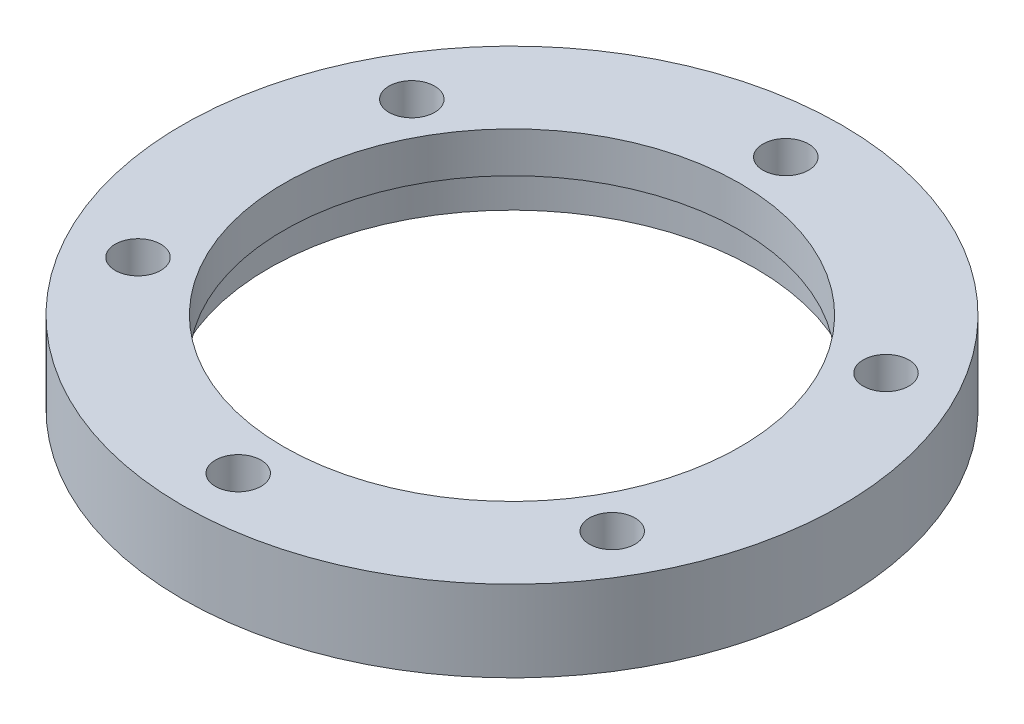
ISO-10303-21;
HEADER;
FILE_DESCRIPTION(('STEP AP214'),'2;1');
FILE_NAME('part.step','',(''),(''),'','','');
FILE_SCHEMA(('AUTOMOTIVE_DESIGN { 1 0 10303 214 1 1 1 1 }'));
ENDSEC;
DATA;
#1=APPLICATION_CONTEXT('core data for automotive mechanical design processes');
#2=APPLICATION_PROTOCOL_DEFINITION('international standard','automotive_design',2000,#1);
#3=PRODUCT_CONTEXT('',#1,'mechanical');
#4=PRODUCT('Part','Part','',(#3));
#5=PRODUCT_RELATED_PRODUCT_CATEGORY('part','',(#4));
#6=PRODUCT_DEFINITION_FORMATION('','',#4);
#7=PRODUCT_DEFINITION_CONTEXT('part definition',#1,'design');
#8=PRODUCT_DEFINITION('design','',#6,#7);
#9=PRODUCT_DEFINITION_SHAPE('','',#8);
#10=(LENGTH_UNIT() NAMED_UNIT(*) SI_UNIT(.MILLI.,.METRE.));
#11=(NAMED_UNIT(*) PLANE_ANGLE_UNIT() SI_UNIT($,.RADIAN.));
#12=(NAMED_UNIT(*) SI_UNIT($,.STERADIAN.) SOLID_ANGLE_UNIT());
#13=UNCERTAINTY_MEASURE_WITH_UNIT(LENGTH_MEASURE(1.E-05),#10,'distance_accuracy_value','');
#14=(GEOMETRIC_REPRESENTATION_CONTEXT(3) GLOBAL_UNCERTAINTY_ASSIGNED_CONTEXT((#13)) GLOBAL_UNIT_ASSIGNED_CONTEXT((#10,
#11,#12)) REPRESENTATION_CONTEXT('',''));
#15=CARTESIAN_POINT('',(0.,0.,0.));
#16=DIRECTION('',(0.,0.,1.));
#17=DIRECTION('',(1.,0.,0.));
#18=AXIS2_PLACEMENT_3D('',#15,#16,#17);
#19=CARTESIAN_POINT('',(-24.,0.,0.));
#20=DIRECTION('',(0.,1.,0.));
#21=DIRECTION('',(0.,0.,1.));
#22=AXIS2_PLACEMENT_3D('',#19,#20,#21);
#23=PLANE('',#22);
#24=CARTESIAN_POINT('',(0.,0.,-27.));
#25=DIRECTION('',(0.,1.,0.));
#26=DIRECTION('',(0.,0.,1.));
#27=AXIS2_PLACEMENT_3D('',#24,#25,#26);
#28=CIRCLE('',#27,2.25);
#29=CARTESIAN_POINT('',(0.,0.,-24.75));
#30=VERTEX_POINT('',#29);
#31=EDGE_CURVE('E76',#30,#30,#28,.T.);
#32=ORIENTED_EDGE('',*,*,#31,.T.);
#33=EDGE_LOOP('',(#32));
#34=FACE_BOUND('',#33,.T.);
#35=CARTESIAN_POINT('',(-23.3826859021799,0.,-13.5));
#36=DIRECTION('',(0.,1.,0.));
#37=DIRECTION('',(0.,0.,1.));
#38=AXIS2_PLACEMENT_3D('',#35,#36,#37);
#39=CIRCLE('',#38,2.25);
#40=CARTESIAN_POINT('',(-23.3826859021799,0.,-11.25));
#41=VERTEX_POINT('',#40);
#42=EDGE_CURVE('E80',#41,#41,#39,.T.);
#43=ORIENTED_EDGE('',*,*,#42,.T.);
#44=EDGE_LOOP('',(#43));
#45=FACE_BOUND('',#44,.T.);
#46=CARTESIAN_POINT('',(-23.3826859021798,0.,13.5));
#47=DIRECTION('',(0.,1.,0.));
#48=DIRECTION('',(0.,0.,1.));
#49=AXIS2_PLACEMENT_3D('',#46,#47,#48);
#50=CIRCLE('',#49,2.25);
#51=CARTESIAN_POINT('',(-23.3826859021798,0.,15.75));
#52=VERTEX_POINT('',#51);
#53=EDGE_CURVE('E84',#52,#52,#50,.T.);
#54=ORIENTED_EDGE('',*,*,#53,.T.);
#55=EDGE_LOOP('',(#54));
#56=FACE_BOUND('',#55,.T.);
#57=CARTESIAN_POINT('',(0.,0.,27.));
#58=DIRECTION('',(0.,1.,0.));
#59=DIRECTION('',(0.,0.,1.));
#60=AXIS2_PLACEMENT_3D('',#57,#58,#59);
#61=CIRCLE('',#60,2.25);
#62=CARTESIAN_POINT('',(0.,0.,29.25));
#63=VERTEX_POINT('',#62);
#64=EDGE_CURVE('E88',#63,#63,#61,.T.);
#65=ORIENTED_EDGE('',*,*,#64,.T.);
#66=EDGE_LOOP('',(#65));
#67=FACE_BOUND('',#66,.T.);
#68=CARTESIAN_POINT('',(23.3826859021798,0.,13.5));
#69=DIRECTION('',(0.,1.,0.));
#70=DIRECTION('',(0.,0.,1.));
#71=AXIS2_PLACEMENT_3D('',#68,#69,#70);
#72=CIRCLE('',#71,2.25);
#73=CARTESIAN_POINT('',(23.3826859021798,0.,15.75));
#74=VERTEX_POINT('',#73);
#75=EDGE_CURVE('E92',#74,#74,#72,.T.);
#76=ORIENTED_EDGE('',*,*,#75,.T.);
#77=EDGE_LOOP('',(#76));
#78=FACE_BOUND('',#77,.T.);
#79=CARTESIAN_POINT('',(23.3826859021798,0.,-13.5));
#80=DIRECTION('',(0.,1.,0.));
#81=DIRECTION('',(0.,0.,1.));
#82=AXIS2_PLACEMENT_3D('',#79,#80,#81);
#83=CIRCLE('',#82,2.25);
#84=CARTESIAN_POINT('',(23.3826859021798,0.,-11.25));
#85=VERTEX_POINT('',#84);
#86=EDGE_CURVE('E96',#85,#85,#83,.T.);
#87=ORIENTED_EDGE('',*,*,#86,.T.);
#88=EDGE_LOOP('',(#87));
#89=FACE_BOUND('',#88,.T.);
#90=CARTESIAN_POINT('',(0.,0.,0.));
#91=DIRECTION('',(0.,-1.,0.));
#92=DIRECTION('',(0.,0.,-1.));
#93=AXIS2_PLACEMENT_3D('',#90,#91,#92);
#94=CIRCLE('',#93,24.);
#95=CARTESIAN_POINT('',(0.,0.,-24.));
#96=VERTEX_POINT('',#95);
#97=EDGE_CURVE('E72',#96,#96,#94,.T.);
#98=ORIENTED_EDGE('',*,*,#97,.F.);
#99=EDGE_LOOP('',(#98));
#100=FACE_BOUND('',#99,.T.);
#101=CARTESIAN_POINT('',(0.,0.,0.));
#102=DIRECTION('',(0.,-1.,0.));
#103=DIRECTION('',(0.,0.,-1.));
#104=AXIS2_PLACEMENT_3D('',#101,#102,#103);
#105=CIRCLE('',#104,32.5);
#106=CARTESIAN_POINT('',(0.,0.,-32.5));
#107=VERTEX_POINT('',#106);
#108=EDGE_CURVE('E10',#107,#107,#105,.T.);
#109=ORIENTED_EDGE('',*,*,#108,.T.);
#110=EDGE_LOOP('',(#109));
#111=FACE_BOUND('',#110,.T.);
#112=ADVANCED_FACE('F45',(#34,#45,#56,#67,#78,#89,#100,#111),#23,.F.);
#113=CARTESIAN_POINT('',(0.,0.,0.));
#114=DIRECTION('',(0.,-1.,0.));
#115=DIRECTION('',(0.,0.,-1.));
#116=AXIS2_PLACEMENT_3D('',#113,#114,#115);
#117=CYLINDRICAL_SURFACE('',#116,32.5);
#118=ORIENTED_EDGE('',*,*,#108,.F.);
#119=EDGE_LOOP('',(#118));
#120=FACE_BOUND('',#119,.T.);
#121=CARTESIAN_POINT('',(0.,8.,0.));
#122=DIRECTION('',(0.,-1.,0.));
#123=DIRECTION('',(0.,0.,-1.));
#124=AXIS2_PLACEMENT_3D('',#121,#122,#123);
#125=CIRCLE('',#124,32.5);
#126=CARTESIAN_POINT('',(0.,8.,-32.5));
#127=VERTEX_POINT('',#126);
#128=EDGE_CURVE('E52',#127,#127,#125,.T.);
#129=ORIENTED_EDGE('',*,*,#128,.T.);
#130=EDGE_LOOP('',(#129));
#131=FACE_BOUND('',#130,.T.);
#132=ADVANCED_FACE('F132',(#120,#131),#117,.T.);
#133=CARTESIAN_POINT('',(-32.5,8.,0.));
#134=DIRECTION('',(0.,-1.,0.));
#135=DIRECTION('',(0.,0.,-1.));
#136=AXIS2_PLACEMENT_3D('',#133,#134,#135);
#137=PLANE('',#136);
#138=CARTESIAN_POINT('',(0.,8.,-27.));
#139=DIRECTION('',(0.,1.,0.));
#140=DIRECTION('',(0.,0.,1.));
#141=AXIS2_PLACEMENT_3D('',#138,#139,#140);
#142=CIRCLE('',#141,2.25);
#143=CARTESIAN_POINT('',(0.,8.,-24.75));
#144=VERTEX_POINT('',#143);
#145=EDGE_CURVE('E100',#144,#144,#142,.T.);
#146=ORIENTED_EDGE('',*,*,#145,.F.);
#147=EDGE_LOOP('',(#146));
#148=FACE_BOUND('',#147,.T.);
#149=CARTESIAN_POINT('',(-23.3826859021799,8.,-13.5));
#150=DIRECTION('',(0.,1.,0.));
#151=DIRECTION('',(0.,0.,1.));
#152=AXIS2_PLACEMENT_3D('',#149,#150,#151);
#153=CIRCLE('',#152,2.25);
#154=CARTESIAN_POINT('',(-23.3826859021799,8.,-11.25));
#155=VERTEX_POINT('',#154);
#156=EDGE_CURVE('E106',#155,#155,#153,.T.);
#157=ORIENTED_EDGE('',*,*,#156,.F.);
#158=EDGE_LOOP('',(#157));
#159=FACE_BOUND('',#158,.T.);
#160=CARTESIAN_POINT('',(-23.3826859021798,8.,13.5));
#161=DIRECTION('',(0.,1.,0.));
#162=DIRECTION('',(0.,0.,1.));
#163=AXIS2_PLACEMENT_3D('',#160,#161,#162);
#164=CIRCLE('',#163,2.25);
#165=CARTESIAN_POINT('',(-23.3826859021798,8.,15.75));
#166=VERTEX_POINT('',#165);
#167=EDGE_CURVE('E101',#166,#166,#164,.T.);
#168=ORIENTED_EDGE('',*,*,#167,.F.);
#169=EDGE_LOOP('',(#168));
#170=FACE_BOUND('',#169,.T.);
#171=CARTESIAN_POINT('',(0.,8.,27.));
#172=DIRECTION('',(0.,1.,0.));
#173=DIRECTION('',(0.,0.,1.));
#174=AXIS2_PLACEMENT_3D('',#171,#172,#173);
#175=CIRCLE('',#174,2.25);
#176=CARTESIAN_POINT('',(0.,8.,29.25));
#177=VERTEX_POINT('',#176);
#178=EDGE_CURVE('E105',#177,#177,#175,.T.);
#179=ORIENTED_EDGE('',*,*,#178,.F.);
#180=EDGE_LOOP('',(#179));
#181=FACE_BOUND('',#180,.T.);
#182=CARTESIAN_POINT('',(23.3826859021798,8.,13.5));
#183=DIRECTION('',(0.,1.,0.));
#184=DIRECTION('',(0.,0.,1.));
#185=AXIS2_PLACEMENT_3D('',#182,#183,#184);
#186=CIRCLE('',#185,2.25);
#187=CARTESIAN_POINT('',(23.3826859021798,8.,15.75));
#188=VERTEX_POINT('',#187);
#189=EDGE_CURVE('E110',#188,#188,#186,.T.);
#190=ORIENTED_EDGE('',*,*,#189,.F.);
#191=EDGE_LOOP('',(#190));
#192=FACE_BOUND('',#191,.T.);
#193=CARTESIAN_POINT('',(23.3826859021798,8.,-13.5));
#194=DIRECTION('',(0.,1.,0.));
#195=DIRECTION('',(0.,0.,1.));
#196=AXIS2_PLACEMENT_3D('',#193,#194,#195);
#197=CIRCLE('',#196,2.25);
#198=CARTESIAN_POINT('',(23.3826859021798,8.,-11.25));
#199=VERTEX_POINT('',#198);
#200=EDGE_CURVE('E114',#199,#199,#197,.T.);
#201=ORIENTED_EDGE('',*,*,#200,.F.);
#202=EDGE_LOOP('',(#201));
#203=FACE_BOUND('',#202,.T.);
#204=ORIENTED_EDGE('',*,*,#128,.F.);
#205=EDGE_LOOP('',(#204));
#206=FACE_BOUND('',#205,.T.);
#207=CARTESIAN_POINT('',(0.,8.,0.));
#208=DIRECTION('',(0.,-1.,0.));
#209=DIRECTION('',(0.,0.,-1.));
#210=AXIS2_PLACEMENT_3D('',#207,#208,#209);
#211=CIRCLE('',#210,22.5);
#212=CARTESIAN_POINT('',(0.,8.,-22.5));
#213=VERTEX_POINT('',#212);
#214=EDGE_CURVE('E57',#213,#213,#211,.T.);
#215=ORIENTED_EDGE('',*,*,#214,.T.);
#216=EDGE_LOOP('',(#215));
#217=FACE_BOUND('',#216,.T.);
#218=ADVANCED_FACE('F128',(#148,#159,#170,#181,#192,#203,#206,#217),#137,.F.);
#219=CARTESIAN_POINT('',(0.,0.,0.));
#220=DIRECTION('',(0.,-1.,0.));
#221=DIRECTION('',(0.,0.,-1.));
#222=AXIS2_PLACEMENT_3D('',#219,#220,#221);
#223=CYLINDRICAL_SURFACE('',#222,22.5);
#224=ORIENTED_EDGE('',*,*,#214,.F.);
#225=EDGE_LOOP('',(#224));
#226=FACE_BOUND('',#225,.T.);
#227=CARTESIAN_POINT('',(0.,4.,0.));
#228=DIRECTION('',(0.,-1.,0.));
#229=DIRECTION('',(0.,0.,-1.));
#230=AXIS2_PLACEMENT_3D('',#227,#228,#229);
#231=CIRCLE('',#230,22.5);
#232=CARTESIAN_POINT('',(0.,4.,-22.5));
#233=VERTEX_POINT('',#232);
#234=EDGE_CURVE('E62',#233,#233,#231,.T.);
#235=ORIENTED_EDGE('',*,*,#234,.T.);
#236=EDGE_LOOP('',(#235));
#237=FACE_BOUND('',#236,.T.);
#238=ADVANCED_FACE('F131',(#226,#237),#223,.F.);
#239=CARTESIAN_POINT('',(-22.5,4.,0.));
#240=DIRECTION('',(0.,1.,0.));
#241=DIRECTION('',(0.,0.,1.));
#242=AXIS2_PLACEMENT_3D('',#239,#240,#241);
#243=PLANE('',#242);
#244=ORIENTED_EDGE('',*,*,#234,.F.);
#245=EDGE_LOOP('',(#244));
#246=FACE_BOUND('',#245,.T.);
#247=CARTESIAN_POINT('',(0.,4.,0.));
#248=DIRECTION('',(0.,-1.,0.));
#249=DIRECTION('',(0.,0.,-1.));
#250=AXIS2_PLACEMENT_3D('',#247,#248,#249);
#251=CIRCLE('',#250,24.);
#252=CARTESIAN_POINT('',(0.,4.,-24.));
#253=VERTEX_POINT('',#252);
#254=EDGE_CURVE('E68',#253,#253,#251,.T.);
#255=ORIENTED_EDGE('',*,*,#254,.T.);
#256=EDGE_LOOP('',(#255));
#257=FACE_BOUND('',#256,.T.);
#258=ADVANCED_FACE('F149',(#246,#257),#243,.F.);
#259=CARTESIAN_POINT('',(0.,0.,0.));
#260=DIRECTION('',(0.,-1.,0.));
#261=DIRECTION('',(0.,0.,-1.));
#262=AXIS2_PLACEMENT_3D('',#259,#260,#261);
#263=CYLINDRICAL_SURFACE('',#262,24.);
#264=ORIENTED_EDGE('',*,*,#254,.F.);
#265=EDGE_LOOP('',(#264));
#266=FACE_BOUND('',#265,.T.);
#267=ORIENTED_EDGE('',*,*,#97,.T.);
#268=EDGE_LOOP('',(#267));
#269=FACE_BOUND('',#268,.T.);
#270=ADVANCED_FACE('F155',(#266,#269),#263,.F.);
#271=CARTESIAN_POINT('',(23.3826859021798,-2.,-13.5));
#272=DIRECTION('',(0.,1.,0.));
#273=DIRECTION('',(0.,0.,1.));
#274=AXIS2_PLACEMENT_3D('',#271,#272,#273);
#275=CYLINDRICAL_SURFACE('',#274,2.25);
#276=ORIENTED_EDGE('',*,*,#200,.T.);
#277=EDGE_LOOP('',(#276));
#278=FACE_BOUND('',#277,.T.);
#279=ORIENTED_EDGE('',*,*,#86,.F.);
#280=EDGE_LOOP('',(#279));
#281=FACE_BOUND('',#280,.T.);
#282=ADVANCED_FACE('F161',(#278,#281),#275,.F.);
#283=CARTESIAN_POINT('',(23.3826859021798,-2.,13.5));
#284=DIRECTION('',(0.,1.,0.));
#285=DIRECTION('',(0.,0.,1.));
#286=AXIS2_PLACEMENT_3D('',#283,#284,#285);
#287=CYLINDRICAL_SURFACE('',#286,2.25);
#288=ORIENTED_EDGE('',*,*,#189,.T.);
#289=EDGE_LOOP('',(#288));
#290=FACE_BOUND('',#289,.T.);
#291=ORIENTED_EDGE('',*,*,#75,.F.);
#292=EDGE_LOOP('',(#291));
#293=FACE_BOUND('',#292,.T.);
#294=ADVANCED_FACE('F184',(#290,#293),#287,.F.);
#295=CARTESIAN_POINT('',(0.,-2.,27.));
#296=DIRECTION('',(0.,1.,0.));
#297=DIRECTION('',(0.,0.,1.));
#298=AXIS2_PLACEMENT_3D('',#295,#296,#297);
#299=CYLINDRICAL_SURFACE('',#298,2.25);
#300=ORIENTED_EDGE('',*,*,#178,.T.);
#301=EDGE_LOOP('',(#300));
#302=FACE_BOUND('',#301,.T.);
#303=ORIENTED_EDGE('',*,*,#64,.F.);
#304=EDGE_LOOP('',(#303));
#305=FACE_BOUND('',#304,.T.);
#306=ADVANCED_FACE('F190',(#302,#305),#299,.F.);
#307=CARTESIAN_POINT('',(-23.3826859021798,-2.,13.5));
#308=DIRECTION('',(0.,1.,0.));
#309=DIRECTION('',(0.,0.,1.));
#310=AXIS2_PLACEMENT_3D('',#307,#308,#309);
#311=CYLINDRICAL_SURFACE('',#310,2.25);
#312=ORIENTED_EDGE('',*,*,#167,.T.);
#313=EDGE_LOOP('',(#312));
#314=FACE_BOUND('',#313,.T.);
#315=ORIENTED_EDGE('',*,*,#53,.F.);
#316=EDGE_LOOP('',(#315));
#317=FACE_BOUND('',#316,.T.);
#318=ADVANCED_FACE('F199',(#314,#317),#311,.F.);
#319=CARTESIAN_POINT('',(-23.3826859021799,-2.,-13.5));
#320=DIRECTION('',(0.,1.,0.));
#321=DIRECTION('',(0.,0.,1.));
#322=AXIS2_PLACEMENT_3D('',#319,#320,#321);
#323=CYLINDRICAL_SURFACE('',#322,2.25);
#324=ORIENTED_EDGE('',*,*,#156,.T.);
#325=EDGE_LOOP('',(#324));
#326=FACE_BOUND('',#325,.T.);
#327=ORIENTED_EDGE('',*,*,#42,.F.);
#328=EDGE_LOOP('',(#327));
#329=FACE_BOUND('',#328,.T.);
#330=ADVANCED_FACE('F194',(#326,#329),#323,.F.);
#331=CARTESIAN_POINT('',(0.,-2.,-27.));
#332=DIRECTION('',(0.,1.,0.));
#333=DIRECTION('',(0.,0.,1.));
#334=AXIS2_PLACEMENT_3D('',#331,#332,#333);
#335=CYLINDRICAL_SURFACE('',#334,2.25);
#336=ORIENTED_EDGE('',*,*,#145,.T.);
#337=EDGE_LOOP('',(#336));
#338=FACE_BOUND('',#337,.T.);
#339=ORIENTED_EDGE('',*,*,#31,.F.);
#340=EDGE_LOOP('',(#339));
#341=FACE_BOUND('',#340,.T.);
#342=ADVANCED_FACE('F125',(#338,#341),#335,.F.);
#343=CLOSED_SHELL('',(#112,#132,#218,#238,#258,#270,#282,#294,#306,#318,#330,#342));
#344=MANIFOLD_SOLID_BREP('B2',#343);
#345=ADVANCED_BREP_SHAPE_REPRESENTATION('',(#18,#344),#14);
#346=SHAPE_DEFINITION_REPRESENTATION(#9,#345);
ENDSEC;
END-ISO-10303-21;
